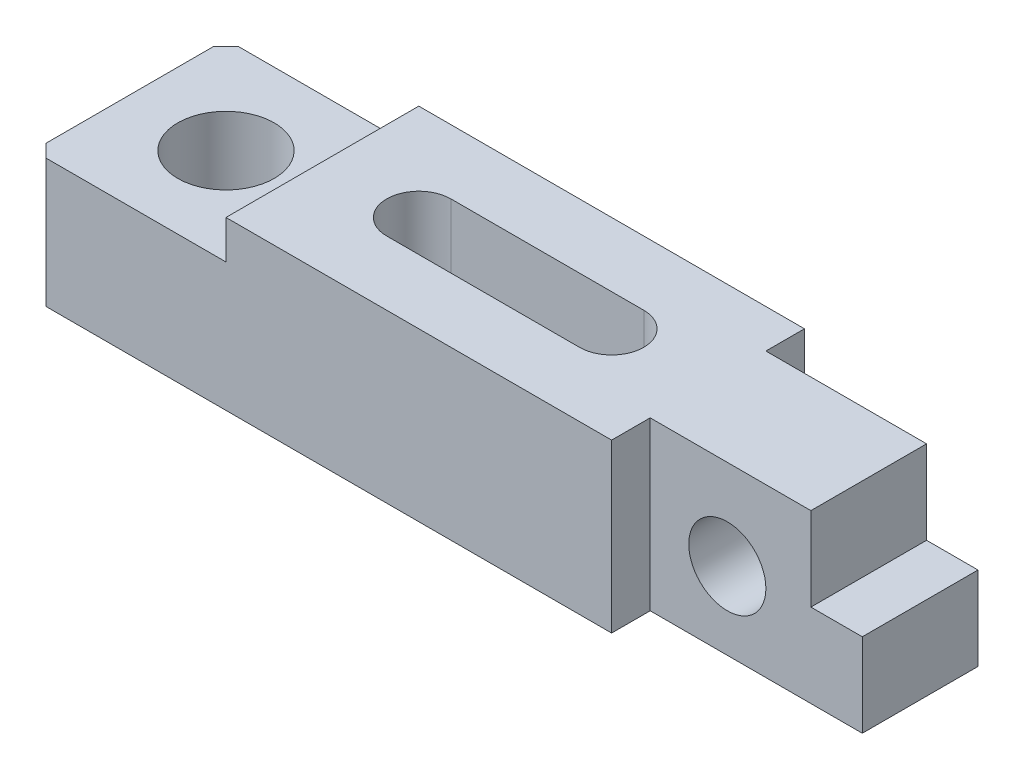
ISO-10303-21;
HEADER;
FILE_DESCRIPTION(('STEP AP214'),'2;1');
FILE_NAME('part.step','',(''),(''),'','','');
FILE_SCHEMA(('AUTOMOTIVE_DESIGN { 1 0 10303 214 1 1 1 1 }'));
ENDSEC;
DATA;
#1=APPLICATION_CONTEXT('core data for automotive mechanical design processes');
#2=APPLICATION_PROTOCOL_DEFINITION('international standard','automotive_design',2000,#1);
#3=PRODUCT_CONTEXT('',#1,'mechanical');
#4=PRODUCT('Part','Part','',(#3));
#5=PRODUCT_RELATED_PRODUCT_CATEGORY('part','',(#4));
#6=PRODUCT_DEFINITION_FORMATION('','',#4);
#7=PRODUCT_DEFINITION_CONTEXT('part definition',#1,'design');
#8=PRODUCT_DEFINITION('design','',#6,#7);
#9=PRODUCT_DEFINITION_SHAPE('','',#8);
#10=(LENGTH_UNIT() NAMED_UNIT(*) SI_UNIT(.MILLI.,.METRE.));
#11=(NAMED_UNIT(*) PLANE_ANGLE_UNIT() SI_UNIT($,.RADIAN.));
#12=(NAMED_UNIT(*) SI_UNIT($,.STERADIAN.) SOLID_ANGLE_UNIT());
#13=UNCERTAINTY_MEASURE_WITH_UNIT(LENGTH_MEASURE(1.E-05),#10,'distance_accuracy_value','');
#14=(GEOMETRIC_REPRESENTATION_CONTEXT(3) GLOBAL_UNCERTAINTY_ASSIGNED_CONTEXT((#13)) GLOBAL_UNIT_ASSIGNED_CONTEXT((#10,
#11,#12)) REPRESENTATION_CONTEXT('',''));
#15=CARTESIAN_POINT('',(0.,0.,0.));
#16=DIRECTION('',(0.,0.,1.));
#17=DIRECTION('',(1.,0.,0.));
#18=AXIS2_PLACEMENT_3D('',#15,#16,#17);
#19=CARTESIAN_POINT('',(0.,20.,15.));
#20=DIRECTION('',(1.,0.,0.));
#21=DIRECTION('',(0.,0.,-1.));
#22=AXIS2_PLACEMENT_3D('',#19,#20,#21);
#23=PLANE('',#22);
#24=DIRECTION('',(0.,0.,-1.));
#25=VECTOR('',#24,1.);
#26=CARTESIAN_POINT('',(0.,20.,15.));
#27=LINE('',#26,#25);
#28=CARTESIAN_POINT('',(0.,20.,13.));
#29=VERTEX_POINT('',#28);
#30=CARTESIAN_POINT('',(0.,20.,-13.));
#31=VERTEX_POINT('',#30);
#32=EDGE_CURVE('E314',#29,#31,#27,.T.);
#33=ORIENTED_EDGE('',*,*,#32,.T.);
#34=DIRECTION('',(0.,-1.,0.));
#35=VECTOR('',#34,1.);
#36=CARTESIAN_POINT('',(0.,20.,-13.));
#37=LINE('',#36,#35);
#38=CARTESIAN_POINT('',(0.,0.,-13.));
#39=VERTEX_POINT('',#38);
#40=EDGE_CURVE('E359',#31,#39,#37,.T.);
#41=ORIENTED_EDGE('',*,*,#40,.T.);
#42=DIRECTION('',(0.,0.,-1.));
#43=VECTOR('',#42,1.);
#44=CARTESIAN_POINT('',(0.,0.,15.));
#45=LINE('',#44,#43);
#46=CARTESIAN_POINT('',(0.,0.,13.));
#47=VERTEX_POINT('',#46);
#48=EDGE_CURVE('E352',#47,#39,#45,.T.);
#49=ORIENTED_EDGE('',*,*,#48,.F.);
#50=DIRECTION('',(0.,1.,0.));
#51=VECTOR('',#50,1.);
#52=CARTESIAN_POINT('',(0.,20.,13.));
#53=LINE('',#52,#51);
#54=EDGE_CURVE('E356',#47,#29,#53,.T.);
#55=ORIENTED_EDGE('',*,*,#54,.T.);
#56=EDGE_LOOP('',(#33,#41,#49,#55));
#57=FACE_BOUND('',#56,.T.);
#58=ADVANCED_FACE('F45',(#57),#23,.F.);
#59=CARTESIAN_POINT('',(0.,0.,15.));
#60=DIRECTION('',(0.,1.,0.));
#61=DIRECTION('',(0.,0.,1.));
#62=AXIS2_PLACEMENT_3D('',#59,#60,#61);
#63=PLANE('',#62);
#64=CARTESIAN_POINT('',(15.,0.,0.));
#65=DIRECTION('',(0.,1.,0.));
#66=DIRECTION('',(0.,0.,1.));
#67=AXIS2_PLACEMENT_3D('',#64,#65,#66);
#68=CIRCLE('',#67,7.49999999999999);
#69=CARTESIAN_POINT('',(15.,0.,7.49999999999999));
#70=VERTEX_POINT('',#69);
#71=EDGE_CURVE('E211',#70,#70,#68,.T.);
#72=ORIENTED_EDGE('',*,*,#71,.T.);
#73=EDGE_LOOP('',(#72));
#74=FACE_BOUND('',#73,.T.);
#75=DIRECTION('',(-1.,0.,0.));
#76=VECTOR('',#75,1.);
#77=CARTESIAN_POINT('',(45.,0.,-5.));
#78=LINE('',#77,#76);
#79=CARTESIAN_POINT('',(75.,0.,-5.));
#80=VERTEX_POINT('',#79);
#81=CARTESIAN_POINT('',(45.,0.,-5.));
#82=VERTEX_POINT('',#81);
#83=EDGE_CURVE('E189',#80,#82,#78,.T.);
#84=ORIENTED_EDGE('',*,*,#83,.T.);
#85=CARTESIAN_POINT('',(45.,0.,0.));
#86=DIRECTION('',(0.,1.,0.));
#87=DIRECTION('',(0.,0.,1.));
#88=AXIS2_PLACEMENT_3D('',#85,#86,#87);
#89=CIRCLE('',#88,5.);
#90=CARTESIAN_POINT('',(45.,0.,5.));
#91=VERTEX_POINT('',#90);
#92=EDGE_CURVE('E180',#82,#91,#89,.T.);
#93=ORIENTED_EDGE('',*,*,#92,.T.);
#94=DIRECTION('',(1.,0.,0.));
#95=VECTOR('',#94,1.);
#96=CARTESIAN_POINT('',(45.,0.,5.));
#97=LINE('',#96,#95);
#98=CARTESIAN_POINT('',(75.,0.,5.));
#99=VERTEX_POINT('',#98);
#100=EDGE_CURVE('E193',#91,#99,#97,.T.);
#101=ORIENTED_EDGE('',*,*,#100,.T.);
#102=CARTESIAN_POINT('',(75.,0.,0.));
#103=DIRECTION('',(0.,1.,0.));
#104=DIRECTION('',(0.,0.,1.));
#105=AXIS2_PLACEMENT_3D('',#102,#103,#104);
#106=CIRCLE('',#105,5.);
#107=EDGE_CURVE('E198',#99,#80,#106,.T.);
#108=ORIENTED_EDGE('',*,*,#107,.T.);
#109=EDGE_LOOP('',(#84,#93,#101,#108));
#110=FACE_BOUND('',#109,.T.);
#111=ORIENTED_EDGE('',*,*,#48,.T.);
#112=DIRECTION('',(-0.70710678118655,0.,0.707106781186545));
#113=VECTOR('',#112,1.);
#114=CARTESIAN_POINT('',(0.,0.,-13.));
#115=LINE('',#114,#113);
#116=CARTESIAN_POINT('',(2.,0.,-15.));
#117=VERTEX_POINT('',#116);
#118=EDGE_CURVE('E366',#39,#117,#115,.F.);
#119=ORIENTED_EDGE('',*,*,#118,.T.);
#120=DIRECTION('',(1.,0.,0.));
#121=VECTOR('',#120,1.);
#122=CARTESIAN_POINT('',(0.,0.,-15.));
#123=LINE('',#122,#121);
#124=CARTESIAN_POINT('',(90.,0.,-15.));
#125=VERTEX_POINT('',#124);
#126=EDGE_CURVE('E300',#117,#125,#123,.T.);
#127=ORIENTED_EDGE('',*,*,#126,.T.);
#128=DIRECTION('',(0.,0.,1.));
#129=VECTOR('',#128,1.);
#130=CARTESIAN_POINT('',(90.,0.,-15.));
#131=LINE('',#130,#129);
#132=CARTESIAN_POINT('',(90.,0.,-9.));
#133=VERTEX_POINT('',#132);
#134=EDGE_CURVE('E266',#125,#133,#131,.T.);
#135=ORIENTED_EDGE('',*,*,#134,.T.);
#136=DIRECTION('',(1.,0.,0.));
#137=VECTOR('',#136,1.);
#138=CARTESIAN_POINT('',(90.,0.,-9.));
#139=LINE('',#138,#137);
#140=CARTESIAN_POINT('',(123.,0.,-9.));
#141=VERTEX_POINT('',#140);
#142=EDGE_CURVE('E276',#133,#141,#139,.T.);
#143=ORIENTED_EDGE('',*,*,#142,.T.);
#144=DIRECTION('',(0.,0.,-1.));
#145=VECTOR('',#144,1.);
#146=CARTESIAN_POINT('',(123.,0.,15.));
#147=LINE('',#146,#145);
#148=CARTESIAN_POINT('',(123.,0.,9.));
#149=VERTEX_POINT('',#148);
#150=EDGE_CURVE('E348',#149,#141,#147,.T.);
#151=ORIENTED_EDGE('',*,*,#150,.F.);
#152=DIRECTION('',(-1.,0.,0.));
#153=VECTOR('',#152,1.);
#154=CARTESIAN_POINT('',(90.,0.,9.));
#155=LINE('',#154,#153);
#156=CARTESIAN_POINT('',(90.,0.,9.));
#157=VERTEX_POINT('',#156);
#158=EDGE_CURVE('E235',#149,#157,#155,.T.);
#159=ORIENTED_EDGE('',*,*,#158,.T.);
#160=DIRECTION('',(0.,0.,1.));
#161=VECTOR('',#160,1.);
#162=CARTESIAN_POINT('',(90.,0.,15.));
#163=LINE('',#162,#161);
#164=CARTESIAN_POINT('',(90.,0.,15.));
#165=VERTEX_POINT('',#164);
#166=EDGE_CURVE('E239',#157,#165,#163,.T.);
#167=ORIENTED_EDGE('',*,*,#166,.T.);
#168=DIRECTION('',(1.,0.,0.));
#169=VECTOR('',#168,1.);
#170=CARTESIAN_POINT('',(0.,0.,15.));
#171=LINE('',#170,#169);
#172=CARTESIAN_POINT('',(1.99999999999999,0.,15.));
#173=VERTEX_POINT('',#172);
#174=EDGE_CURVE('E301',#173,#165,#171,.T.);
#175=ORIENTED_EDGE('',*,*,#174,.F.);
#176=DIRECTION('',(-0.707106781186545,0.,-0.70710678118655));
#177=VECTOR('',#176,1.);
#178=CARTESIAN_POINT('',(1.99999999999999,0.,15.));
#179=LINE('',#178,#177);
#180=EDGE_CURVE('E363',#173,#47,#179,.T.);
#181=ORIENTED_EDGE('',*,*,#180,.T.);
#182=EDGE_LOOP('',(#111,#119,#127,#135,#143,#151,#159,#167,#175,#181));
#183=FACE_BOUND('',#182,.T.);
#184=ADVANCED_FACE('F200',(#74,#110,#183),#63,.F.);
#185=CARTESIAN_POINT('',(123.,0.,15.));
#186=DIRECTION('',(-1.,0.,0.));
#187=DIRECTION('',(0.,0.,1.));
#188=AXIS2_PLACEMENT_3D('',#185,#186,#187);
#189=PLANE('',#188);
#190=DIRECTION('',(0.,0.,-1.));
#191=VECTOR('',#190,1.);
#192=CARTESIAN_POINT('',(123.,13.,15.));
#193=LINE('',#192,#191);
#194=CARTESIAN_POINT('',(123.,13.,9.));
#195=VERTEX_POINT('',#194);
#196=CARTESIAN_POINT('',(123.,13.,-9.));
#197=VERTEX_POINT('',#196);
#198=EDGE_CURVE('E344',#195,#197,#193,.T.);
#199=ORIENTED_EDGE('',*,*,#198,.F.);
#200=DIRECTION('',(0.,1.,0.));
#201=VECTOR('',#200,1.);
#202=CARTESIAN_POINT('',(123.,0.,9.));
#203=LINE('',#202,#201);
#204=EDGE_CURVE('E244',#149,#195,#203,.T.);
#205=ORIENTED_EDGE('',*,*,#204,.F.);
#206=ORIENTED_EDGE('',*,*,#150,.T.);
#207=DIRECTION('',(0.,1.,0.));
#208=VECTOR('',#207,1.);
#209=CARTESIAN_POINT('',(123.,0.,-9.));
#210=LINE('',#209,#208);
#211=EDGE_CURVE('E262',#141,#197,#210,.T.);
#212=ORIENTED_EDGE('',*,*,#211,.T.);
#213=EDGE_LOOP('',(#199,#205,#206,#212));
#214=FACE_BOUND('',#213,.T.);
#215=ADVANCED_FACE('F406',(#214),#189,.F.);
#216=CARTESIAN_POINT('',(123.,13.,15.));
#217=DIRECTION('',(0.,-1.,0.));
#218=DIRECTION('',(0.,0.,-1.));
#219=AXIS2_PLACEMENT_3D('',#216,#217,#218);
#220=PLANE('',#219);
#221=DIRECTION('',(0.,0.,-1.));
#222=VECTOR('',#221,1.);
#223=CARTESIAN_POINT('',(115.,13.,15.));
#224=LINE('',#223,#222);
#225=CARTESIAN_POINT('',(115.,13.,9.));
#226=VERTEX_POINT('',#225);
#227=CARTESIAN_POINT('',(115.,13.,-9.));
#228=VERTEX_POINT('',#227);
#229=EDGE_CURVE('E340',#226,#228,#224,.T.);
#230=ORIENTED_EDGE('',*,*,#229,.F.);
#231=DIRECTION('',(1.,0.,0.));
#232=VECTOR('',#231,1.);
#233=CARTESIAN_POINT('',(123.,13.,9.));
#234=LINE('',#233,#232);
#235=EDGE_CURVE('E296',#226,#195,#234,.T.);
#236=ORIENTED_EDGE('',*,*,#235,.T.);
#237=ORIENTED_EDGE('',*,*,#198,.T.);
#238=DIRECTION('',(-1.,0.,0.));
#239=VECTOR('',#238,1.);
#240=CARTESIAN_POINT('',(123.,13.,-9.));
#241=LINE('',#240,#239);
#242=EDGE_CURVE('E288',#197,#228,#241,.T.);
#243=ORIENTED_EDGE('',*,*,#242,.T.);
#244=EDGE_LOOP('',(#230,#236,#237,#243));
#245=FACE_BOUND('',#244,.T.);
#246=ADVANCED_FACE('F403',(#245),#220,.F.);
#247=CARTESIAN_POINT('',(115.,13.,15.));
#248=DIRECTION('',(-1.,0.,0.));
#249=DIRECTION('',(0.,0.,1.));
#250=AXIS2_PLACEMENT_3D('',#247,#248,#249);
#251=PLANE('',#250);
#252=DIRECTION('',(0.,0.,-1.));
#253=VECTOR('',#252,1.);
#254=CARTESIAN_POINT('',(115.,26.,15.));
#255=LINE('',#254,#253);
#256=CARTESIAN_POINT('',(115.,26.,9.));
#257=VERTEX_POINT('',#256);
#258=CARTESIAN_POINT('',(115.,26.,-9.));
#259=VERTEX_POINT('',#258);
#260=EDGE_CURVE('E336',#257,#259,#255,.T.);
#261=ORIENTED_EDGE('',*,*,#260,.F.);
#262=DIRECTION('',(0.,-1.,0.));
#263=VECTOR('',#262,1.);
#264=CARTESIAN_POINT('',(115.,13.,9.));
#265=LINE('',#264,#263);
#266=EDGE_CURVE('E292',#257,#226,#265,.T.);
#267=ORIENTED_EDGE('',*,*,#266,.T.);
#268=ORIENTED_EDGE('',*,*,#229,.T.);
#269=DIRECTION('',(0.,1.,0.));
#270=VECTOR('',#269,1.);
#271=CARTESIAN_POINT('',(115.,13.,-9.));
#272=LINE('',#271,#270);
#273=EDGE_CURVE('E255',#228,#259,#272,.T.);
#274=ORIENTED_EDGE('',*,*,#273,.T.);
#275=EDGE_LOOP('',(#261,#267,#268,#274));
#276=FACE_BOUND('',#275,.T.);
#277=ADVANCED_FACE('F400',(#276),#251,.F.);
#278=CARTESIAN_POINT('',(115.,26.,15.));
#279=DIRECTION('',(0.,-1.,0.));
#280=DIRECTION('',(0.,0.,-1.));
#281=AXIS2_PLACEMENT_3D('',#278,#279,#280);
#282=PLANE('',#281);
#283=DIRECTION('',(1.,0.,0.));
#284=VECTOR('',#283,1.);
#285=CARTESIAN_POINT('',(45.,26.,5.));
#286=LINE('',#285,#284);
#287=CARTESIAN_POINT('',(45.,26.,5.));
#288=VERTEX_POINT('',#287);
#289=CARTESIAN_POINT('',(75.,26.,5.));
#290=VERTEX_POINT('',#289);
#291=EDGE_CURVE('E220',#288,#290,#286,.T.);
#292=ORIENTED_EDGE('',*,*,#291,.F.);
#293=CARTESIAN_POINT('',(45.,26.,0.));
#294=DIRECTION('',(0.,1.,0.));
#295=DIRECTION('',(0.,0.,1.));
#296=AXIS2_PLACEMENT_3D('',#293,#294,#295);
#297=CIRCLE('',#296,5.);
#298=CARTESIAN_POINT('',(45.,26.,-5.));
#299=VERTEX_POINT('',#298);
#300=EDGE_CURVE('E183',#299,#288,#297,.T.);
#301=ORIENTED_EDGE('',*,*,#300,.F.);
#302=DIRECTION('',(-1.,0.,0.));
#303=VECTOR('',#302,1.);
#304=CARTESIAN_POINT('',(45.,26.,-5.));
#305=LINE('',#304,#303);
#306=CARTESIAN_POINT('',(75.,26.,-5.));
#307=VERTEX_POINT('',#306);
#308=EDGE_CURVE('E204',#307,#299,#305,.T.);
#309=ORIENTED_EDGE('',*,*,#308,.F.);
#310=CARTESIAN_POINT('',(75.,26.,0.));
#311=DIRECTION('',(0.,1.,0.));
#312=DIRECTION('',(0.,0.,1.));
#313=AXIS2_PLACEMENT_3D('',#310,#311,#312);
#314=CIRCLE('',#313,5.);
#315=EDGE_CURVE('E208',#290,#307,#314,.T.);
#316=ORIENTED_EDGE('',*,*,#315,.F.);
#317=EDGE_LOOP('',(#292,#301,#309,#316));
#318=FACE_BOUND('',#317,.T.);
#319=DIRECTION('',(-1.,0.,0.));
#320=VECTOR('',#319,1.);
#321=CARTESIAN_POINT('',(115.,26.,15.));
#322=LINE('',#321,#320);
#323=CARTESIAN_POINT('',(90.,26.,15.));
#324=VERTEX_POINT('',#323);
#325=CARTESIAN_POINT('',(30.,26.,15.));
#326=VERTEX_POINT('',#325);
#327=EDGE_CURVE('E304',#324,#326,#322,.T.);
#328=ORIENTED_EDGE('',*,*,#327,.F.);
#329=DIRECTION('',(0.,0.,1.));
#330=VECTOR('',#329,1.);
#331=CARTESIAN_POINT('',(90.,26.,15.));
#332=LINE('',#331,#330);
#333=CARTESIAN_POINT('',(90.,26.,9.));
#334=VERTEX_POINT('',#333);
#335=EDGE_CURVE('E240',#334,#324,#332,.T.);
#336=ORIENTED_EDGE('',*,*,#335,.F.);
#337=DIRECTION('',(-1.,0.,0.));
#338=VECTOR('',#337,1.);
#339=CARTESIAN_POINT('',(90.,26.,9.));
#340=LINE('',#339,#338);
#341=EDGE_CURVE('E245',#257,#334,#340,.T.);
#342=ORIENTED_EDGE('',*,*,#341,.F.);
#343=ORIENTED_EDGE('',*,*,#260,.T.);
#344=DIRECTION('',(1.,0.,0.));
#345=VECTOR('',#344,1.);
#346=CARTESIAN_POINT('',(90.,26.,-9.));
#347=LINE('',#346,#345);
#348=CARTESIAN_POINT('',(90.,26.,-9.));
#349=VERTEX_POINT('',#348);
#350=EDGE_CURVE('E248',#349,#259,#347,.T.);
#351=ORIENTED_EDGE('',*,*,#350,.F.);
#352=DIRECTION('',(0.,0.,1.));
#353=VECTOR('',#352,1.);
#354=CARTESIAN_POINT('',(90.,26.,-15.));
#355=LINE('',#354,#353);
#356=CARTESIAN_POINT('',(90.,26.,-15.));
#357=VERTEX_POINT('',#356);
#358=EDGE_CURVE('E272',#357,#349,#355,.T.);
#359=ORIENTED_EDGE('',*,*,#358,.F.);
#360=DIRECTION('',(-1.,0.,0.));
#361=VECTOR('',#360,1.);
#362=CARTESIAN_POINT('',(115.,26.,-15.));
#363=LINE('',#362,#361);
#364=CARTESIAN_POINT('',(30.,26.,-15.));
#365=VERTEX_POINT('',#364);
#366=EDGE_CURVE('E317',#357,#365,#363,.T.);
#367=ORIENTED_EDGE('',*,*,#366,.T.);
#368=DIRECTION('',(0.,0.,-1.));
#369=VECTOR('',#368,1.);
#370=CARTESIAN_POINT('',(30.,26.,15.));
#371=LINE('',#370,#369);
#372=EDGE_CURVE('E332',#326,#365,#371,.T.);
#373=ORIENTED_EDGE('',*,*,#372,.F.);
#374=EDGE_LOOP('',(#328,#336,#342,#343,#351,#359,#367,#373));
#375=FACE_BOUND('',#374,.T.);
#376=ADVANCED_FACE('F392',(#318,#375),#282,.F.);
#377=CARTESIAN_POINT('',(30.,26.,15.));
#378=DIRECTION('',(1.,0.,0.));
#379=DIRECTION('',(0.,0.,-1.));
#380=AXIS2_PLACEMENT_3D('',#377,#378,#379);
#381=PLANE('',#380);
#382=DIRECTION('',(0.,-1.,0.));
#383=VECTOR('',#382,1.);
#384=CARTESIAN_POINT('',(30.,26.,-15.));
#385=LINE('',#384,#383);
#386=CARTESIAN_POINT('',(30.,20.,-15.));
#387=VERTEX_POINT('',#386);
#388=EDGE_CURVE('E320',#365,#387,#385,.T.);
#389=ORIENTED_EDGE('',*,*,#388,.T.);
#390=DIRECTION('',(0.,0.,-1.));
#391=VECTOR('',#390,1.);
#392=CARTESIAN_POINT('',(30.,20.,15.));
#393=LINE('',#392,#391);
#394=CARTESIAN_POINT('',(30.,20.,15.));
#395=VERTEX_POINT('',#394);
#396=EDGE_CURVE('E328',#395,#387,#393,.T.);
#397=ORIENTED_EDGE('',*,*,#396,.F.);
#398=DIRECTION('',(0.,-1.,0.));
#399=VECTOR('',#398,1.);
#400=CARTESIAN_POINT('',(30.,26.,15.));
#401=LINE('',#400,#399);
#402=EDGE_CURVE('E308',#326,#395,#401,.T.);
#403=ORIENTED_EDGE('',*,*,#402,.F.);
#404=ORIENTED_EDGE('',*,*,#372,.T.);
#405=EDGE_LOOP('',(#389,#397,#403,#404));
#406=FACE_BOUND('',#405,.T.);
#407=ADVANCED_FACE('F422',(#406),#381,.F.);
#408=CARTESIAN_POINT('',(30.,20.,15.));
#409=DIRECTION('',(0.,-1.,0.));
#410=DIRECTION('',(0.,0.,-1.));
#411=AXIS2_PLACEMENT_3D('',#408,#409,#410);
#412=PLANE('',#411);
#413=CARTESIAN_POINT('',(15.,20.,0.));
#414=DIRECTION('',(0.,1.,0.));
#415=DIRECTION('',(0.,0.,1.));
#416=AXIS2_PLACEMENT_3D('',#413,#414,#415);
#417=CIRCLE('',#416,7.49999999999999);
#418=CARTESIAN_POINT('',(15.,20.,7.49999999999999));
#419=VERTEX_POINT('',#418);
#420=EDGE_CURVE('E501',#419,#419,#417,.T.);
#421=ORIENTED_EDGE('',*,*,#420,.F.);
#422=EDGE_LOOP('',(#421));
#423=FACE_BOUND('',#422,.T.);
#424=DIRECTION('',(-1.,0.,0.));
#425=VECTOR('',#424,1.);
#426=CARTESIAN_POINT('',(30.,20.,-15.));
#427=LINE('',#426,#425);
#428=CARTESIAN_POINT('',(2.,20.,-15.));
#429=VERTEX_POINT('',#428);
#430=EDGE_CURVE('E305',#387,#429,#427,.T.);
#431=ORIENTED_EDGE('',*,*,#430,.T.);
#432=DIRECTION('',(0.70710678118655,0.,-0.707106781186545));
#433=VECTOR('',#432,1.);
#434=CARTESIAN_POINT('',(0.,20.,-13.));
#435=LINE('',#434,#433);
#436=EDGE_CURVE('E55',#429,#31,#435,.F.);
#437=ORIENTED_EDGE('',*,*,#436,.T.);
#438=ORIENTED_EDGE('',*,*,#32,.F.);
#439=DIRECTION('',(0.707106781186545,0.,0.70710678118655));
#440=VECTOR('',#439,1.);
#441=CARTESIAN_POINT('',(1.99999999999999,20.,15.));
#442=LINE('',#441,#440);
#443=CARTESIAN_POINT('',(1.99999999999999,20.,15.));
#444=VERTEX_POINT('',#443);
#445=EDGE_CURVE('E62',#29,#444,#442,.T.);
#446=ORIENTED_EDGE('',*,*,#445,.T.);
#447=DIRECTION('',(-1.,0.,0.));
#448=VECTOR('',#447,1.);
#449=CARTESIAN_POINT('',(30.,20.,15.));
#450=LINE('',#449,#448);
#451=EDGE_CURVE('E311',#395,#444,#450,.T.);
#452=ORIENTED_EDGE('',*,*,#451,.F.);
#453=ORIENTED_EDGE('',*,*,#396,.T.);
#454=EDGE_LOOP('',(#431,#437,#438,#446,#452,#453));
#455=FACE_BOUND('',#454,.T.);
#456=ADVANCED_FACE('F374',(#423,#455),#412,.F.);
#457=CARTESIAN_POINT('',(0.,0.,15.));
#458=DIRECTION('',(0.,0.,1.));
#459=DIRECTION('',(1.,0.,0.));
#460=AXIS2_PLACEMENT_3D('',#457,#458,#459);
#461=PLANE('',#460);
#462=ORIENTED_EDGE('',*,*,#451,.T.);
#463=DIRECTION('',(0.,-1.,0.));
#464=VECTOR('',#463,1.);
#465=CARTESIAN_POINT('',(1.99999999999999,0.,15.));
#466=LINE('',#465,#464);
#467=EDGE_CURVE('E11',#444,#173,#466,.T.);
#468=ORIENTED_EDGE('',*,*,#467,.T.);
#469=ORIENTED_EDGE('',*,*,#174,.T.);
#470=DIRECTION('',(0.,1.,0.));
#471=VECTOR('',#470,1.);
#472=CARTESIAN_POINT('',(90.,0.,15.));
#473=LINE('',#472,#471);
#474=EDGE_CURVE('E251',#165,#324,#473,.T.);
#475=ORIENTED_EDGE('',*,*,#474,.T.);
#476=ORIENTED_EDGE('',*,*,#327,.T.);
#477=ORIENTED_EDGE('',*,*,#402,.T.);
#478=EDGE_LOOP('',(#462,#468,#469,#475,#476,#477));
#479=FACE_BOUND('',#478,.T.);
#480=ADVANCED_FACE('F418',(#479),#461,.T.);
#481=CARTESIAN_POINT('',(0.,0.,-15.));
#482=DIRECTION('',(0.,0.,1.));
#483=DIRECTION('',(1.,0.,0.));
#484=AXIS2_PLACEMENT_3D('',#481,#482,#483);
#485=PLANE('',#484);
#486=ORIENTED_EDGE('',*,*,#126,.F.);
#487=DIRECTION('',(0.,1.,0.));
#488=VECTOR('',#487,1.);
#489=CARTESIAN_POINT('',(2.,0.,-15.));
#490=LINE('',#489,#488);
#491=EDGE_CURVE('E70',#117,#429,#490,.T.);
#492=ORIENTED_EDGE('',*,*,#491,.T.);
#493=ORIENTED_EDGE('',*,*,#430,.F.);
#494=ORIENTED_EDGE('',*,*,#388,.F.);
#495=ORIENTED_EDGE('',*,*,#366,.F.);
#496=DIRECTION('',(0.,1.,0.));
#497=VECTOR('',#496,1.);
#498=CARTESIAN_POINT('',(90.,0.,-15.));
#499=LINE('',#498,#497);
#500=EDGE_CURVE('E267',#125,#357,#499,.T.);
#501=ORIENTED_EDGE('',*,*,#500,.F.);
#502=EDGE_LOOP('',(#486,#492,#493,#494,#495,#501));
#503=FACE_BOUND('',#502,.T.);
#504=ADVANCED_FACE('F383',(#503),#485,.F.);
#505=CARTESIAN_POINT('',(90.,0.,-9.));
#506=DIRECTION('',(0.,0.,1.));
#507=DIRECTION('',(1.,0.,0.));
#508=AXIS2_PLACEMENT_3D('',#505,#506,#507);
#509=PLANE('',#508);
#510=CARTESIAN_POINT('',(102.,12.,-9.));
#511=DIRECTION('',(0.,0.,1.));
#512=DIRECTION('',(1.,0.,0.));
#513=AXIS2_PLACEMENT_3D('',#510,#511,#512);
#514=CIRCLE('',#513,6.);
#515=CARTESIAN_POINT('',(108.,12.,-9.));
#516=VERTEX_POINT('',#515);
#517=EDGE_CURVE('E494',#516,#516,#514,.T.);
#518=ORIENTED_EDGE('',*,*,#517,.T.);
#519=EDGE_LOOP('',(#518));
#520=FACE_BOUND('',#519,.T.);
#521=ORIENTED_EDGE('',*,*,#211,.F.);
#522=ORIENTED_EDGE('',*,*,#142,.F.);
#523=DIRECTION('',(0.,1.,0.));
#524=VECTOR('',#523,1.);
#525=CARTESIAN_POINT('',(90.,0.,-9.));
#526=LINE('',#525,#524);
#527=EDGE_CURVE('E229',#133,#349,#526,.T.);
#528=ORIENTED_EDGE('',*,*,#527,.T.);
#529=ORIENTED_EDGE('',*,*,#350,.T.);
#530=ORIENTED_EDGE('',*,*,#273,.F.);
#531=ORIENTED_EDGE('',*,*,#242,.F.);
#532=EDGE_LOOP('',(#521,#522,#528,#529,#530,#531));
#533=FACE_BOUND('',#532,.T.);
#534=ADVANCED_FACE('F397',(#520,#533),#509,.F.);
#535=CARTESIAN_POINT('',(90.,0.,-15.));
#536=DIRECTION('',(-1.,0.,0.));
#537=DIRECTION('',(0.,0.,1.));
#538=AXIS2_PLACEMENT_3D('',#535,#536,#537);
#539=PLANE('',#538);
#540=ORIENTED_EDGE('',*,*,#358,.T.);
#541=ORIENTED_EDGE('',*,*,#527,.F.);
#542=ORIENTED_EDGE('',*,*,#134,.F.);
#543=ORIENTED_EDGE('',*,*,#500,.T.);
#544=EDGE_LOOP('',(#540,#541,#542,#543));
#545=FACE_BOUND('',#544,.T.);
#546=ADVANCED_FACE('F388',(#545),#539,.F.);
#547=CARTESIAN_POINT('',(90.,0.,9.));
#548=DIRECTION('',(0.,0.,-1.));
#549=DIRECTION('',(-1.,0.,0.));
#550=AXIS2_PLACEMENT_3D('',#547,#548,#549);
#551=PLANE('',#550);
#552=CARTESIAN_POINT('',(102.,12.,9.));
#553=DIRECTION('',(0.,0.,1.));
#554=DIRECTION('',(1.,0.,0.));
#555=AXIS2_PLACEMENT_3D('',#552,#553,#554);
#556=CIRCLE('',#555,6.00000000000001);
#557=CARTESIAN_POINT('',(108.,12.,9.));
#558=VERTEX_POINT('',#557);
#559=EDGE_CURVE('E497',#558,#558,#556,.T.);
#560=ORIENTED_EDGE('',*,*,#559,.F.);
#561=EDGE_LOOP('',(#560));
#562=FACE_BOUND('',#561,.T.);
#563=ORIENTED_EDGE('',*,*,#266,.F.);
#564=ORIENTED_EDGE('',*,*,#341,.T.);
#565=DIRECTION('',(0.,1.,0.));
#566=VECTOR('',#565,1.);
#567=CARTESIAN_POINT('',(90.,0.,9.));
#568=LINE('',#567,#566);
#569=EDGE_CURVE('E256',#157,#334,#568,.T.);
#570=ORIENTED_EDGE('',*,*,#569,.F.);
#571=ORIENTED_EDGE('',*,*,#158,.F.);
#572=ORIENTED_EDGE('',*,*,#204,.T.);
#573=ORIENTED_EDGE('',*,*,#235,.F.);
#574=EDGE_LOOP('',(#563,#564,#570,#571,#572,#573));
#575=FACE_BOUND('',#574,.T.);
#576=ADVANCED_FACE('F412',(#562,#575),#551,.F.);
#577=CARTESIAN_POINT('',(90.,0.,15.));
#578=DIRECTION('',(-1.,0.,0.));
#579=DIRECTION('',(0.,0.,1.));
#580=AXIS2_PLACEMENT_3D('',#577,#578,#579);
#581=PLANE('',#580);
#582=ORIENTED_EDGE('',*,*,#335,.T.);
#583=ORIENTED_EDGE('',*,*,#474,.F.);
#584=ORIENTED_EDGE('',*,*,#166,.F.);
#585=ORIENTED_EDGE('',*,*,#569,.T.);
#586=EDGE_LOOP('',(#582,#583,#584,#585));
#587=FACE_BOUND('',#586,.T.);
#588=ADVANCED_FACE('F416',(#587),#581,.F.);
#589=CARTESIAN_POINT('',(45.,0.,0.));
#590=DIRECTION('',(0.,1.,0.));
#591=DIRECTION('',(0.,0.,1.));
#592=AXIS2_PLACEMENT_3D('',#589,#590,#591);
#593=CYLINDRICAL_SURFACE('',#592,5.);
#594=ORIENTED_EDGE('',*,*,#300,.T.);
#595=DIRECTION('',(0.,1.,0.));
#596=VECTOR('',#595,1.);
#597=CARTESIAN_POINT('',(45.,0.,5.));
#598=LINE('',#597,#596);
#599=EDGE_CURVE('E176',#91,#288,#598,.T.);
#600=ORIENTED_EDGE('',*,*,#599,.F.);
#601=ORIENTED_EDGE('',*,*,#92,.F.);
#602=DIRECTION('',(0.,1.,0.));
#603=VECTOR('',#602,1.);
#604=CARTESIAN_POINT('',(45.,0.,-5.));
#605=LINE('',#604,#603);
#606=EDGE_CURVE('E226',#82,#299,#605,.T.);
#607=ORIENTED_EDGE('',*,*,#606,.T.);
#608=EDGE_LOOP('',(#594,#600,#601,#607));
#609=FACE_BOUND('',#608,.T.);
#610=ADVANCED_FACE('F178',(#609),#593,.F.);
#611=CARTESIAN_POINT('',(45.,0.,-5.));
#612=DIRECTION('',(0.,0.,-1.));
#613=DIRECTION('',(-1.,0.,0.));
#614=AXIS2_PLACEMENT_3D('',#611,#612,#613);
#615=PLANE('',#614);
#616=ORIENTED_EDGE('',*,*,#308,.T.);
#617=ORIENTED_EDGE('',*,*,#606,.F.);
#618=ORIENTED_EDGE('',*,*,#83,.F.);
#619=DIRECTION('',(0.,1.,0.));
#620=VECTOR('',#619,1.);
#621=CARTESIAN_POINT('',(75.,0.,-5.));
#622=LINE('',#621,#620);
#623=EDGE_CURVE('E230',#80,#307,#622,.T.);
#624=ORIENTED_EDGE('',*,*,#623,.T.);
#625=EDGE_LOOP('',(#616,#617,#618,#624));
#626=FACE_BOUND('',#625,.T.);
#627=ADVANCED_FACE('F473',(#626),#615,.F.);
#628=CARTESIAN_POINT('',(75.,0.,0.));
#629=DIRECTION('',(0.,1.,0.));
#630=DIRECTION('',(0.,0.,1.));
#631=AXIS2_PLACEMENT_3D('',#628,#629,#630);
#632=CYLINDRICAL_SURFACE('',#631,5.);
#633=ORIENTED_EDGE('',*,*,#315,.T.);
#634=ORIENTED_EDGE('',*,*,#623,.F.);
#635=ORIENTED_EDGE('',*,*,#107,.F.);
#636=DIRECTION('',(0.,1.,0.));
#637=VECTOR('',#636,1.);
#638=CARTESIAN_POINT('',(75.,0.,5.));
#639=LINE('',#638,#637);
#640=EDGE_CURVE('E188',#99,#290,#639,.T.);
#641=ORIENTED_EDGE('',*,*,#640,.T.);
#642=EDGE_LOOP('',(#633,#634,#635,#641));
#643=FACE_BOUND('',#642,.T.);
#644=ADVANCED_FACE('F477',(#643),#632,.F.);
#645=CARTESIAN_POINT('',(45.,0.,5.));
#646=DIRECTION('',(0.,0.,1.));
#647=DIRECTION('',(1.,0.,0.));
#648=AXIS2_PLACEMENT_3D('',#645,#646,#647);
#649=PLANE('',#648);
#650=ORIENTED_EDGE('',*,*,#291,.T.);
#651=ORIENTED_EDGE('',*,*,#640,.F.);
#652=ORIENTED_EDGE('',*,*,#100,.F.);
#653=ORIENTED_EDGE('',*,*,#599,.T.);
#654=EDGE_LOOP('',(#650,#651,#652,#653));
#655=FACE_BOUND('',#654,.T.);
#656=ADVANCED_FACE('F194',(#655),#649,.F.);
#657=CARTESIAN_POINT('',(15.,20.,0.));
#658=DIRECTION('',(0.,1.,0.));
#659=DIRECTION('',(0.,0.,1.));
#660=AXIS2_PLACEMENT_3D('',#657,#658,#659);
#661=CYLINDRICAL_SURFACE('',#660,7.49999999999999);
#662=ORIENTED_EDGE('',*,*,#71,.F.);
#663=EDGE_LOOP('',(#662));
#664=FACE_BOUND('',#663,.T.);
#665=ORIENTED_EDGE('',*,*,#420,.T.);
#666=EDGE_LOOP('',(#665));
#667=FACE_BOUND('',#666,.T.);
#668=ADVANCED_FACE('F476',(#664,#667),#661,.F.);
#669=CARTESIAN_POINT('',(102.,12.,9.));
#670=DIRECTION('',(0.,0.,1.));
#671=DIRECTION('',(1.,0.,0.));
#672=AXIS2_PLACEMENT_3D('',#669,#670,#671);
#673=CYLINDRICAL_SURFACE('',#672,6.);
#674=ORIENTED_EDGE('',*,*,#517,.F.);
#675=EDGE_LOOP('',(#674));
#676=FACE_BOUND('',#675,.T.);
#677=ORIENTED_EDGE('',*,*,#559,.T.);
#678=EDGE_LOOP('',(#677));
#679=FACE_BOUND('',#678,.T.);
#680=ADVANCED_FACE('F429',(#676,#679),#673,.F.);
#681=CARTESIAN_POINT('',(0.,20.,-13.));
#682=DIRECTION('',(0.707106781186545,0.,0.70710678118655));
#683=DIRECTION('',(0.,-1.,0.));
#684=AXIS2_PLACEMENT_3D('',#681,#682,#683);
#685=PLANE('',#684);
#686=ORIENTED_EDGE('',*,*,#436,.F.);
#687=ORIENTED_EDGE('',*,*,#491,.F.);
#688=ORIENTED_EDGE('',*,*,#118,.F.);
#689=ORIENTED_EDGE('',*,*,#40,.F.);
#690=EDGE_LOOP('',(#686,#687,#688,#689));
#691=FACE_BOUND('',#690,.T.);
#692=ADVANCED_FACE('F380',(#691),#685,.F.);
#693=CARTESIAN_POINT('',(1.99999999999999,0.,15.));
#694=DIRECTION('',(-0.70710678118655,0.,0.707106781186545));
#695=DIRECTION('',(0.,1.,0.));
#696=AXIS2_PLACEMENT_3D('',#693,#694,#695);
#697=PLANE('',#696);
#698=ORIENTED_EDGE('',*,*,#445,.F.);
#699=ORIENTED_EDGE('',*,*,#54,.F.);
#700=ORIENTED_EDGE('',*,*,#180,.F.);
#701=ORIENTED_EDGE('',*,*,#467,.F.);
#702=EDGE_LOOP('',(#698,#699,#700,#701));
#703=FACE_BOUND('',#702,.T.);
#704=ADVANCED_FACE('F48',(#703),#697,.T.);
#705=CLOSED_SHELL('',(#58,#184,#215,#246,#277,#376,#407,#456,#480,#504,#534,#546,#576,#588,#610,
#627,#644,#656,#668,#680,#692,#704));
#706=MANIFOLD_SOLID_BREP('B2',#705);
#707=ADVANCED_BREP_SHAPE_REPRESENTATION('',(#18,#706),#14);
#708=SHAPE_DEFINITION_REPRESENTATION(#9,#707);
ENDSEC;
END-ISO-10303-21;
